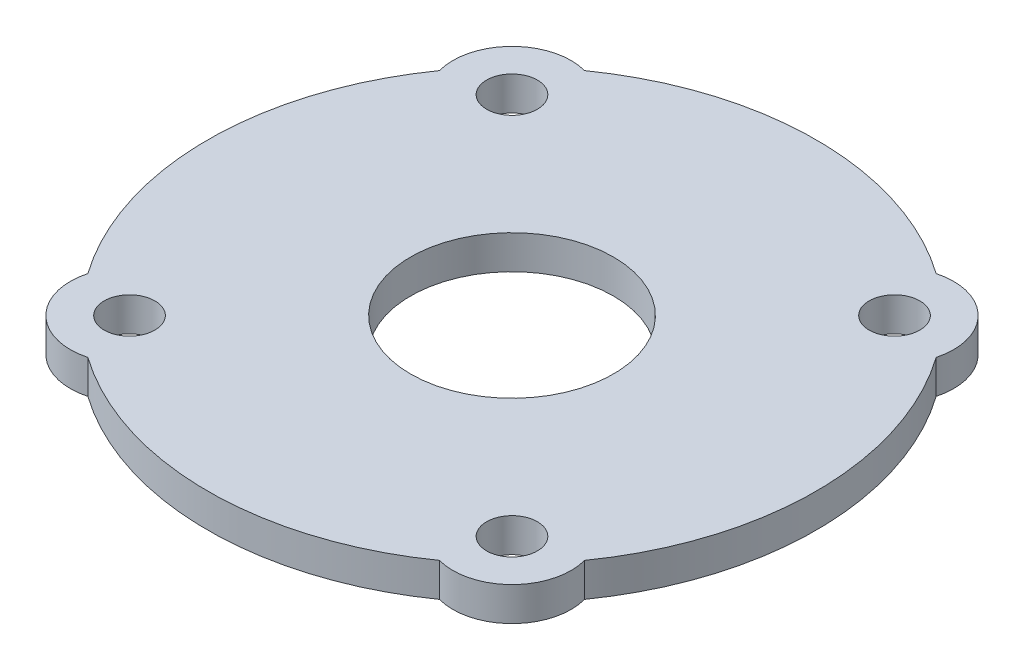
ISO-10303-21;
HEADER;
FILE_DESCRIPTION(('STEP AP214'),'2;1');
FILE_NAME('part.step','',(''),(''),'','','');
FILE_SCHEMA(('AUTOMOTIVE_DESIGN { 1 0 10303 214 1 1 1 1 }'));
ENDSEC;
DATA;
#1=APPLICATION_CONTEXT('core data for automotive mechanical design processes');
#2=APPLICATION_PROTOCOL_DEFINITION('international standard','automotive_design',2000,#1);
#3=PRODUCT_CONTEXT('',#1,'mechanical');
#4=PRODUCT('Part','Part','',(#3));
#5=PRODUCT_RELATED_PRODUCT_CATEGORY('part','',(#4));
#6=PRODUCT_DEFINITION_FORMATION('','',#4);
#7=PRODUCT_DEFINITION_CONTEXT('part definition',#1,'design');
#8=PRODUCT_DEFINITION('design','',#6,#7);
#9=PRODUCT_DEFINITION_SHAPE('','',#8);
#10=(LENGTH_UNIT() NAMED_UNIT(*) SI_UNIT(.MILLI.,.METRE.));
#11=(NAMED_UNIT(*) PLANE_ANGLE_UNIT() SI_UNIT($,.RADIAN.));
#12=(NAMED_UNIT(*) SI_UNIT($,.STERADIAN.) SOLID_ANGLE_UNIT());
#13=UNCERTAINTY_MEASURE_WITH_UNIT(LENGTH_MEASURE(1.E-05),#10,'distance_accuracy_value','');
#14=(GEOMETRIC_REPRESENTATION_CONTEXT(3) GLOBAL_UNCERTAINTY_ASSIGNED_CONTEXT((#13)) GLOBAL_UNIT_ASSIGNED_CONTEXT((#10,
#11,#12)) REPRESENTATION_CONTEXT('',''));
#15=CARTESIAN_POINT('',(0.,0.,0.));
#16=DIRECTION('',(0.,0.,1.));
#17=DIRECTION('',(1.,0.,0.));
#18=AXIS2_PLACEMENT_3D('',#15,#16,#17);
#19=CARTESIAN_POINT('',(-8.98025612106914,1.5875,-8.98025612106917));
#20=DIRECTION('',(0.,1.,0.));
#21=DIRECTION('',(0.,0.,1.));
#22=AXIS2_PLACEMENT_3D('',#19,#20,#21);
#23=PLANE('',#22);
#24=CARTESIAN_POINT('',(17.9605122421383,1.5875,17.9605122421383));
#25=DIRECTION('',(0.,1.,0.));
#26=DIRECTION('',(0.,0.,1.));
#27=AXIS2_PLACEMENT_3D('',#24,#25,#26);
#28=CIRCLE('',#27,2.38125);
#29=CARTESIAN_POINT('',(17.9605122421383,1.5875,20.3417622421383));
#30=VERTEX_POINT('',#29);
#31=EDGE_CURVE('E202',#30,#30,#28,.T.);
#32=ORIENTED_EDGE('',*,*,#31,.F.);
#33=EDGE_LOOP('',(#32));
#34=FACE_BOUND('',#33,.T.);
#35=CARTESIAN_POINT('',(17.9605122421383,1.5875,-17.9605122421383));
#36=DIRECTION('',(0.,1.,0.));
#37=DIRECTION('',(0.,0.,-1.));
#38=AXIS2_PLACEMENT_3D('',#35,#36,#37);
#39=CIRCLE('',#38,2.38125);
#40=CARTESIAN_POINT('',(17.9605122421383,1.5875,-20.3417622421383));
#41=VERTEX_POINT('',#40);
#42=EDGE_CURVE('E190',#41,#41,#39,.T.);
#43=ORIENTED_EDGE('',*,*,#42,.F.);
#44=EDGE_LOOP('',(#43));
#45=FACE_BOUND('',#44,.T.);
#46=CARTESIAN_POINT('',(0.,1.5875,0.));
#47=DIRECTION('',(0.,1.,0.));
#48=DIRECTION('',(0.,0.,1.));
#49=AXIS2_PLACEMENT_3D('',#46,#47,#48);
#50=CIRCLE('',#49,28.575);
#51=CARTESIAN_POINT('',(16.5086309525813,1.5875,-23.3237160219265));
#52=VERTEX_POINT('',#51);
#53=CARTESIAN_POINT('',(-16.5086309525813,1.5875,-23.3237160219265));
#54=VERTEX_POINT('',#53);
#55=EDGE_CURVE('E153',#52,#54,#50,.T.);
#56=ORIENTED_EDGE('',*,*,#55,.T.);
#57=CARTESIAN_POINT('',(-17.9605122421383,1.5875,-17.9605122421383));
#58=DIRECTION('',(0.,1.,0.));
#59=DIRECTION('',(0.,0.,1.));
#60=AXIS2_PLACEMENT_3D('',#57,#58,#59);
#61=CIRCLE('',#60,5.55625);
#62=CARTESIAN_POINT('',(-23.3237160219265,1.5875,-16.5086309525814));
#63=VERTEX_POINT('',#62);
#64=EDGE_CURVE('E101',#54,#63,#61,.T.);
#65=ORIENTED_EDGE('',*,*,#64,.T.);
#66=CARTESIAN_POINT('',(0.,1.5875,0.));
#67=DIRECTION('',(0.,1.,0.));
#68=DIRECTION('',(0.,0.,1.));
#69=AXIS2_PLACEMENT_3D('',#66,#67,#68);
#70=CIRCLE('',#69,28.575);
#71=CARTESIAN_POINT('',(-23.3237160219265,1.5875,16.5086309525814));
#72=VERTEX_POINT('',#71);
#73=EDGE_CURVE('E168',#63,#72,#70,.T.);
#74=ORIENTED_EDGE('',*,*,#73,.T.);
#75=CARTESIAN_POINT('',(-17.9605122421383,1.5875,17.9605122421383));
#76=DIRECTION('',(0.,1.,0.));
#77=DIRECTION('',(0.,0.,-1.));
#78=AXIS2_PLACEMENT_3D('',#75,#76,#77);
#79=CIRCLE('',#78,5.55625);
#80=CARTESIAN_POINT('',(-16.5086309525813,1.5875,23.3237160219265));
#81=VERTEX_POINT('',#80);
#82=EDGE_CURVE('E181',#72,#81,#79,.T.);
#83=ORIENTED_EDGE('',*,*,#82,.T.);
#84=CARTESIAN_POINT('',(0.,1.5875,0.));
#85=DIRECTION('',(0.,1.,0.));
#86=DIRECTION('',(0.,0.,1.));
#87=AXIS2_PLACEMENT_3D('',#84,#85,#86);
#88=CIRCLE('',#87,28.575);
#89=CARTESIAN_POINT('',(16.5086309525813,1.5875,23.3237160219265));
#90=VERTEX_POINT('',#89);
#91=EDGE_CURVE('E120',#81,#90,#88,.T.);
#92=ORIENTED_EDGE('',*,*,#91,.T.);
#93=CARTESIAN_POINT('',(17.9605122421383,1.5875,17.9605122421383));
#94=DIRECTION('',(0.,1.,0.));
#95=DIRECTION('',(0.,0.,1.));
#96=AXIS2_PLACEMENT_3D('',#93,#94,#95);
#97=CIRCLE('',#96,5.55625);
#98=CARTESIAN_POINT('',(23.3237160219265,1.5875,16.5086309525814));
#99=VERTEX_POINT('',#98);
#100=EDGE_CURVE('E114',#90,#99,#97,.T.);
#101=ORIENTED_EDGE('',*,*,#100,.T.);
#102=CARTESIAN_POINT('',(0.,1.5875,0.));
#103=DIRECTION('',(0.,1.,0.));
#104=DIRECTION('',(0.,0.,1.));
#105=AXIS2_PLACEMENT_3D('',#102,#103,#104);
#106=CIRCLE('',#105,28.575);
#107=CARTESIAN_POINT('',(23.3237160219265,1.5875,-16.5086309525814));
#108=VERTEX_POINT('',#107);
#109=EDGE_CURVE('E118',#99,#108,#106,.T.);
#110=ORIENTED_EDGE('',*,*,#109,.T.);
#111=CARTESIAN_POINT('',(17.9605122421383,1.5875,-17.9605122421383));
#112=DIRECTION('',(0.,1.,0.));
#113=DIRECTION('',(0.,0.,-1.));
#114=AXIS2_PLACEMENT_3D('',#111,#112,#113);
#115=CIRCLE('',#114,5.55625);
#116=EDGE_CURVE('E58',#108,#52,#115,.T.);
#117=ORIENTED_EDGE('',*,*,#116,.T.);
#118=EDGE_LOOP('',(#56,#65,#74,#83,#92,#101,#110,#117));
#119=FACE_BOUND('',#118,.T.);
#120=CARTESIAN_POINT('',(-17.9605122421383,1.5875,-17.9605122421383));
#121=DIRECTION('',(0.,1.,0.));
#122=DIRECTION('',(0.,0.,1.));
#123=AXIS2_PLACEMENT_3D('',#120,#121,#122);
#124=CIRCLE('',#123,2.38125);
#125=CARTESIAN_POINT('',(-17.9605122421383,1.5875,-15.5792622421383));
#126=VERTEX_POINT('',#125);
#127=EDGE_CURVE('E142',#126,#126,#124,.T.);
#128=ORIENTED_EDGE('',*,*,#127,.F.);
#129=EDGE_LOOP('',(#128));
#130=FACE_BOUND('',#129,.T.);
#131=CARTESIAN_POINT('',(-17.9605122421383,1.5875,17.9605122421383));
#132=DIRECTION('',(0.,1.,0.));
#133=DIRECTION('',(0.,0.,-1.));
#134=AXIS2_PLACEMENT_3D('',#131,#132,#133);
#135=CIRCLE('',#134,2.38125);
#136=CARTESIAN_POINT('',(-17.9605122421383,1.5875,15.5792622421383));
#137=VERTEX_POINT('',#136);
#138=EDGE_CURVE('E196',#137,#137,#135,.T.);
#139=ORIENTED_EDGE('',*,*,#138,.F.);
#140=EDGE_LOOP('',(#139));
#141=FACE_BOUND('',#140,.T.);
#142=CARTESIAN_POINT('',(0.,1.5875,0.));
#143=DIRECTION('',(0.,1.,0.));
#144=DIRECTION('',(0.,0.,1.));
#145=AXIS2_PLACEMENT_3D('',#142,#143,#144);
#146=CIRCLE('',#145,9.525);
#147=CARTESIAN_POINT('',(0.,1.5875,9.525));
#148=VERTEX_POINT('',#147);
#149=EDGE_CURVE('E208',#148,#148,#146,.T.);
#150=ORIENTED_EDGE('',*,*,#149,.F.);
#151=EDGE_LOOP('',(#150));
#152=FACE_BOUND('',#151,.T.);
#153=ADVANCED_FACE('F41',(#34,#45,#119,#130,#141,#152),#23,.T.);
#154=CARTESIAN_POINT('',(-8.98025612106914,-1.5875,-8.98025612106917));
#155=DIRECTION('',(0.,1.,0.));
#156=DIRECTION('',(0.,0.,1.));
#157=AXIS2_PLACEMENT_3D('',#154,#155,#156);
#158=PLANE('',#157);
#159=CARTESIAN_POINT('',(0.,-1.5875,0.));
#160=DIRECTION('',(0.,1.,0.));
#161=DIRECTION('',(0.,0.,1.));
#162=AXIS2_PLACEMENT_3D('',#159,#160,#161);
#163=CIRCLE('',#162,28.575);
#164=CARTESIAN_POINT('',(16.5086309525813,-1.5875,-23.3237160219265));
#165=VERTEX_POINT('',#164);
#166=CARTESIAN_POINT('',(-16.5086309525813,-1.5875,-23.3237160219265));
#167=VERTEX_POINT('',#166);
#168=EDGE_CURVE('E138',#165,#167,#163,.T.);
#169=ORIENTED_EDGE('',*,*,#168,.F.);
#170=CARTESIAN_POINT('',(17.9605122421383,-1.5875,-17.9605122421383));
#171=DIRECTION('',(0.,1.,0.));
#172=DIRECTION('',(0.,0.,-1.));
#173=AXIS2_PLACEMENT_3D('',#170,#171,#172);
#174=CIRCLE('',#173,5.55625);
#175=CARTESIAN_POINT('',(23.3237160219265,-1.5875,-16.5086309525814));
#176=VERTEX_POINT('',#175);
#177=EDGE_CURVE('E93',#176,#165,#174,.T.);
#178=ORIENTED_EDGE('',*,*,#177,.F.);
#179=CARTESIAN_POINT('',(0.,-1.5875,0.));
#180=DIRECTION('',(0.,1.,0.));
#181=DIRECTION('',(0.,0.,1.));
#182=AXIS2_PLACEMENT_3D('',#179,#180,#181);
#183=CIRCLE('',#182,28.575);
#184=CARTESIAN_POINT('',(23.3237160219265,-1.5875,16.5086309525814));
#185=VERTEX_POINT('',#184);
#186=EDGE_CURVE('E87',#185,#176,#183,.T.);
#187=ORIENTED_EDGE('',*,*,#186,.F.);
#188=CARTESIAN_POINT('',(17.9605122421383,-1.5875,17.9605122421383));
#189=DIRECTION('',(0.,1.,0.));
#190=DIRECTION('',(0.,0.,1.));
#191=AXIS2_PLACEMENT_3D('',#188,#189,#190);
#192=CIRCLE('',#191,5.55625);
#193=CARTESIAN_POINT('',(16.5086309525813,-1.5875,23.3237160219265));
#194=VERTEX_POINT('',#193);
#195=EDGE_CURVE('E128',#194,#185,#192,.T.);
#196=ORIENTED_EDGE('',*,*,#195,.F.);
#197=CARTESIAN_POINT('',(0.,-1.5875,0.));
#198=DIRECTION('',(0.,1.,0.));
#199=DIRECTION('',(0.,0.,1.));
#200=AXIS2_PLACEMENT_3D('',#197,#198,#199);
#201=CIRCLE('',#200,28.575);
#202=CARTESIAN_POINT('',(-16.5086309525813,-1.5875,23.3237160219265));
#203=VERTEX_POINT('',#202);
#204=EDGE_CURVE('E148',#203,#194,#201,.T.);
#205=ORIENTED_EDGE('',*,*,#204,.F.);
#206=CARTESIAN_POINT('',(-17.9605122421383,-1.5875,17.9605122421383));
#207=DIRECTION('',(0.,1.,0.));
#208=DIRECTION('',(0.,0.,-1.));
#209=AXIS2_PLACEMENT_3D('',#206,#207,#208);
#210=CIRCLE('',#209,5.55625);
#211=CARTESIAN_POINT('',(-23.3237160219265,-1.5875,16.5086309525814));
#212=VERTEX_POINT('',#211);
#213=EDGE_CURVE('E146',#212,#203,#210,.T.);
#214=ORIENTED_EDGE('',*,*,#213,.F.);
#215=CARTESIAN_POINT('',(0.,-1.5875,0.));
#216=DIRECTION('',(0.,1.,0.));
#217=DIRECTION('',(0.,0.,1.));
#218=AXIS2_PLACEMENT_3D('',#215,#216,#217);
#219=CIRCLE('',#218,28.575);
#220=CARTESIAN_POINT('',(-23.3237160219265,-1.5875,-16.5086309525814));
#221=VERTEX_POINT('',#220);
#222=EDGE_CURVE('E144',#221,#212,#219,.T.);
#223=ORIENTED_EDGE('',*,*,#222,.F.);
#224=CARTESIAN_POINT('',(-17.9605122421383,-1.5875,-17.9605122421383));
#225=DIRECTION('',(0.,1.,0.));
#226=DIRECTION('',(0.,0.,1.));
#227=AXIS2_PLACEMENT_3D('',#224,#225,#226);
#228=CIRCLE('',#227,5.55625);
#229=EDGE_CURVE('E141',#167,#221,#228,.T.);
#230=ORIENTED_EDGE('',*,*,#229,.F.);
#231=EDGE_LOOP('',(#169,#178,#187,#196,#205,#214,#223,#230));
#232=FACE_BOUND('',#231,.T.);
#233=CARTESIAN_POINT('',(-17.9605122421383,-1.5875,-17.9605122421383));
#234=DIRECTION('',(0.,1.,0.));
#235=DIRECTION('',(0.,0.,1.));
#236=AXIS2_PLACEMENT_3D('',#233,#234,#235);
#237=CIRCLE('',#236,2.38125);
#238=CARTESIAN_POINT('',(-17.9605122421383,-1.5875,-15.5792622421383));
#239=VERTEX_POINT('',#238);
#240=EDGE_CURVE('E187',#239,#239,#237,.T.);
#241=ORIENTED_EDGE('',*,*,#240,.T.);
#242=EDGE_LOOP('',(#241));
#243=FACE_BOUND('',#242,.T.);
#244=CARTESIAN_POINT('',(17.9605122421383,-1.5875,-17.9605122421383));
#245=DIRECTION('',(0.,1.,0.));
#246=DIRECTION('',(0.,0.,-1.));
#247=AXIS2_PLACEMENT_3D('',#244,#245,#246);
#248=CIRCLE('',#247,2.38125);
#249=CARTESIAN_POINT('',(17.9605122421383,-1.5875,-20.3417622421383));
#250=VERTEX_POINT('',#249);
#251=EDGE_CURVE('E193',#250,#250,#248,.T.);
#252=ORIENTED_EDGE('',*,*,#251,.T.);
#253=EDGE_LOOP('',(#252));
#254=FACE_BOUND('',#253,.T.);
#255=CARTESIAN_POINT('',(-17.9605122421383,-1.5875,17.9605122421383));
#256=DIRECTION('',(0.,1.,0.));
#257=DIRECTION('',(0.,0.,-1.));
#258=AXIS2_PLACEMENT_3D('',#255,#256,#257);
#259=CIRCLE('',#258,2.38125);
#260=CARTESIAN_POINT('',(-17.9605122421383,-1.5875,15.5792622421383));
#261=VERTEX_POINT('',#260);
#262=EDGE_CURVE('E199',#261,#261,#259,.T.);
#263=ORIENTED_EDGE('',*,*,#262,.T.);
#264=EDGE_LOOP('',(#263));
#265=FACE_BOUND('',#264,.T.);
#266=CARTESIAN_POINT('',(17.9605122421383,-1.5875,17.9605122421383));
#267=DIRECTION('',(0.,1.,0.));
#268=DIRECTION('',(0.,0.,1.));
#269=AXIS2_PLACEMENT_3D('',#266,#267,#268);
#270=CIRCLE('',#269,2.38125);
#271=CARTESIAN_POINT('',(17.9605122421383,-1.5875,20.3417622421383));
#272=VERTEX_POINT('',#271);
#273=EDGE_CURVE('E205',#272,#272,#270,.T.);
#274=ORIENTED_EDGE('',*,*,#273,.T.);
#275=EDGE_LOOP('',(#274));
#276=FACE_BOUND('',#275,.T.);
#277=CARTESIAN_POINT('',(0.,-1.5875,0.));
#278=DIRECTION('',(0.,1.,0.));
#279=DIRECTION('',(0.,0.,1.));
#280=AXIS2_PLACEMENT_3D('',#277,#278,#279);
#281=CIRCLE('',#280,9.525);
#282=CARTESIAN_POINT('',(0.,-1.5875,9.525));
#283=VERTEX_POINT('',#282);
#284=EDGE_CURVE('E211',#283,#283,#281,.T.);
#285=ORIENTED_EDGE('',*,*,#284,.T.);
#286=EDGE_LOOP('',(#285));
#287=FACE_BOUND('',#286,.T.);
#288=ADVANCED_FACE('F172',(#232,#243,#254,#265,#276,#287),#158,.F.);
#289=CARTESIAN_POINT('',(0.,1.5875,0.));
#290=DIRECTION('',(0.,-1.,0.));
#291=DIRECTION('',(0.,0.,-1.));
#292=AXIS2_PLACEMENT_3D('',#289,#290,#291);
#293=CYLINDRICAL_SURFACE('',#292,28.575);
#294=ORIENTED_EDGE('',*,*,#168,.T.);
#295=DIRECTION('',(0.,-1.,0.));
#296=VECTOR('',#295,1.);
#297=CARTESIAN_POINT('',(-16.5086309525813,1.5875,-23.3237160219265));
#298=LINE('',#297,#296);
#299=EDGE_CURVE('E11',#54,#167,#298,.T.);
#300=ORIENTED_EDGE('',*,*,#299,.F.);
#301=ORIENTED_EDGE('',*,*,#55,.F.);
#302=DIRECTION('',(0.,-1.,0.));
#303=VECTOR('',#302,1.);
#304=CARTESIAN_POINT('',(16.5086309525813,1.5875,-23.3237160219265));
#305=LINE('',#304,#303);
#306=EDGE_CURVE('E134',#52,#165,#305,.T.);
#307=ORIENTED_EDGE('',*,*,#306,.T.);
#308=EDGE_LOOP('',(#294,#300,#301,#307));
#309=FACE_BOUND('',#308,.T.);
#310=ADVANCED_FACE('F43',(#309),#293,.T.);
#311=CARTESIAN_POINT('',(-17.9605122421383,1.5875,-17.9605122421383));
#312=DIRECTION('',(0.,-1.,0.));
#313=DIRECTION('',(0.,0.,-1.));
#314=AXIS2_PLACEMENT_3D('',#311,#312,#313);
#315=CYLINDRICAL_SURFACE('',#314,5.55625);
#316=ORIENTED_EDGE('',*,*,#229,.T.);
#317=DIRECTION('',(0.,-1.,0.));
#318=VECTOR('',#317,1.);
#319=CARTESIAN_POINT('',(-23.3237160219265,1.5875,-16.5086309525814));
#320=LINE('',#319,#318);
#321=EDGE_CURVE('E50',#63,#221,#320,.T.);
#322=ORIENTED_EDGE('',*,*,#321,.F.);
#323=ORIENTED_EDGE('',*,*,#64,.F.);
#324=ORIENTED_EDGE('',*,*,#299,.T.);
#325=EDGE_LOOP('',(#316,#322,#323,#324));
#326=FACE_BOUND('',#325,.T.);
#327=ADVANCED_FACE('F245',(#326),#315,.T.);
#328=CARTESIAN_POINT('',(0.,1.5875,0.));
#329=DIRECTION('',(0.,-1.,0.));
#330=DIRECTION('',(0.,0.,-1.));
#331=AXIS2_PLACEMENT_3D('',#328,#329,#330);
#332=CYLINDRICAL_SURFACE('',#331,28.575);
#333=ORIENTED_EDGE('',*,*,#222,.T.);
#334=DIRECTION('',(0.,-1.,0.));
#335=VECTOR('',#334,1.);
#336=CARTESIAN_POINT('',(-23.3237160219265,1.5875,16.5086309525814));
#337=LINE('',#336,#335);
#338=EDGE_CURVE('E160',#72,#212,#337,.T.);
#339=ORIENTED_EDGE('',*,*,#338,.F.);
#340=ORIENTED_EDGE('',*,*,#73,.F.);
#341=ORIENTED_EDGE('',*,*,#321,.T.);
#342=EDGE_LOOP('',(#333,#339,#340,#341));
#343=FACE_BOUND('',#342,.T.);
#344=ADVANCED_FACE('F166',(#343),#332,.T.);
#345=CARTESIAN_POINT('',(-17.9605122421383,1.5875,17.9605122421383));
#346=DIRECTION('',(0.,-1.,0.));
#347=DIRECTION('',(0.,0.,-1.));
#348=AXIS2_PLACEMENT_3D('',#345,#346,#347);
#349=CYLINDRICAL_SURFACE('',#348,5.55625);
#350=ORIENTED_EDGE('',*,*,#213,.T.);
#351=DIRECTION('',(0.,-1.,0.));
#352=VECTOR('',#351,1.);
#353=CARTESIAN_POINT('',(-16.5086309525813,1.5875,23.3237160219265));
#354=LINE('',#353,#352);
#355=EDGE_CURVE('E157',#81,#203,#354,.T.);
#356=ORIENTED_EDGE('',*,*,#355,.F.);
#357=ORIENTED_EDGE('',*,*,#82,.F.);
#358=ORIENTED_EDGE('',*,*,#338,.T.);
#359=EDGE_LOOP('',(#350,#356,#357,#358));
#360=FACE_BOUND('',#359,.T.);
#361=ADVANCED_FACE('F177',(#360),#349,.T.);
#362=CARTESIAN_POINT('',(0.,1.5875,0.));
#363=DIRECTION('',(0.,-1.,0.));
#364=DIRECTION('',(0.,0.,-1.));
#365=AXIS2_PLACEMENT_3D('',#362,#363,#364);
#366=CYLINDRICAL_SURFACE('',#365,28.575);
#367=ORIENTED_EDGE('',*,*,#204,.T.);
#368=DIRECTION('',(0.,-1.,0.));
#369=VECTOR('',#368,1.);
#370=CARTESIAN_POINT('',(16.5086309525813,1.5875,23.3237160219265));
#371=LINE('',#370,#369);
#372=EDGE_CURVE('E129',#90,#194,#371,.T.);
#373=ORIENTED_EDGE('',*,*,#372,.F.);
#374=ORIENTED_EDGE('',*,*,#91,.F.);
#375=ORIENTED_EDGE('',*,*,#355,.T.);
#376=EDGE_LOOP('',(#367,#373,#374,#375));
#377=FACE_BOUND('',#376,.T.);
#378=ADVANCED_FACE('F180',(#377),#366,.T.);
#379=CARTESIAN_POINT('',(17.9605122421383,1.5875,17.9605122421383));
#380=DIRECTION('',(0.,-1.,0.));
#381=DIRECTION('',(0.,0.,-1.));
#382=AXIS2_PLACEMENT_3D('',#379,#380,#381);
#383=CYLINDRICAL_SURFACE('',#382,5.55625);
#384=ORIENTED_EDGE('',*,*,#195,.T.);
#385=DIRECTION('',(0.,-1.,0.));
#386=VECTOR('',#385,1.);
#387=CARTESIAN_POINT('',(23.3237160219265,1.5875,16.5086309525814));
#388=LINE('',#387,#386);
#389=EDGE_CURVE('E125',#99,#185,#388,.T.);
#390=ORIENTED_EDGE('',*,*,#389,.F.);
#391=ORIENTED_EDGE('',*,*,#100,.F.);
#392=ORIENTED_EDGE('',*,*,#372,.T.);
#393=EDGE_LOOP('',(#384,#390,#391,#392));
#394=FACE_BOUND('',#393,.T.);
#395=ADVANCED_FACE('F126',(#394),#383,.T.);
#396=CARTESIAN_POINT('',(0.,1.5875,0.));
#397=DIRECTION('',(0.,-1.,0.));
#398=DIRECTION('',(0.,0.,-1.));
#399=AXIS2_PLACEMENT_3D('',#396,#397,#398);
#400=CYLINDRICAL_SURFACE('',#399,28.575);
#401=ORIENTED_EDGE('',*,*,#186,.T.);
#402=DIRECTION('',(0.,-1.,0.));
#403=VECTOR('',#402,1.);
#404=CARTESIAN_POINT('',(23.3237160219265,1.5875,-16.5086309525814));
#405=LINE('',#404,#403);
#406=EDGE_CURVE('E130',#108,#176,#405,.T.);
#407=ORIENTED_EDGE('',*,*,#406,.F.);
#408=ORIENTED_EDGE('',*,*,#109,.F.);
#409=ORIENTED_EDGE('',*,*,#389,.T.);
#410=EDGE_LOOP('',(#401,#407,#408,#409));
#411=FACE_BOUND('',#410,.T.);
#412=ADVANCED_FACE('F132',(#411),#400,.T.);
#413=CARTESIAN_POINT('',(17.9605122421383,1.5875,-17.9605122421383));
#414=DIRECTION('',(0.,-1.,0.));
#415=DIRECTION('',(0.,0.,-1.));
#416=AXIS2_PLACEMENT_3D('',#413,#414,#415);
#417=CYLINDRICAL_SURFACE('',#416,5.55625);
#418=ORIENTED_EDGE('',*,*,#177,.T.);
#419=ORIENTED_EDGE('',*,*,#306,.F.);
#420=ORIENTED_EDGE('',*,*,#116,.F.);
#421=ORIENTED_EDGE('',*,*,#406,.T.);
#422=EDGE_LOOP('',(#418,#419,#420,#421));
#423=FACE_BOUND('',#422,.T.);
#424=ADVANCED_FACE('F233',(#423),#417,.T.);
#425=CARTESIAN_POINT('',(-17.9605122421383,1.5875,-17.9605122421383));
#426=DIRECTION('',(0.,-1.,0.));
#427=DIRECTION('',(0.,0.,-1.));
#428=AXIS2_PLACEMENT_3D('',#425,#426,#427);
#429=CYLINDRICAL_SURFACE('',#428,2.38125);
#430=ORIENTED_EDGE('',*,*,#127,.T.);
#431=EDGE_LOOP('',(#430));
#432=FACE_BOUND('',#431,.T.);
#433=ORIENTED_EDGE('',*,*,#240,.F.);
#434=EDGE_LOOP('',(#433));
#435=FACE_BOUND('',#434,.T.);
#436=ADVANCED_FACE('F230',(#432,#435),#429,.F.);
#437=CARTESIAN_POINT('',(17.9605122421383,1.5875,-17.9605122421383));
#438=DIRECTION('',(0.,-1.,0.));
#439=DIRECTION('',(0.,0.,-1.));
#440=AXIS2_PLACEMENT_3D('',#437,#438,#439);
#441=CYLINDRICAL_SURFACE('',#440,2.38125);
#442=ORIENTED_EDGE('',*,*,#42,.T.);
#443=EDGE_LOOP('',(#442));
#444=FACE_BOUND('',#443,.T.);
#445=ORIENTED_EDGE('',*,*,#251,.F.);
#446=EDGE_LOOP('',(#445));
#447=FACE_BOUND('',#446,.T.);
#448=ADVANCED_FACE('F321',(#444,#447),#441,.F.);
#449=CARTESIAN_POINT('',(-17.9605122421383,1.5875,17.9605122421383));
#450=DIRECTION('',(0.,-1.,0.));
#451=DIRECTION('',(0.,0.,-1.));
#452=AXIS2_PLACEMENT_3D('',#449,#450,#451);
#453=CYLINDRICAL_SURFACE('',#452,2.38125);
#454=ORIENTED_EDGE('',*,*,#138,.T.);
#455=EDGE_LOOP('',(#454));
#456=FACE_BOUND('',#455,.T.);
#457=ORIENTED_EDGE('',*,*,#262,.F.);
#458=EDGE_LOOP('',(#457));
#459=FACE_BOUND('',#458,.T.);
#460=ADVANCED_FACE('F330',(#456,#459),#453,.F.);
#461=CARTESIAN_POINT('',(17.9605122421383,1.5875,17.9605122421383));
#462=DIRECTION('',(0.,-1.,0.));
#463=DIRECTION('',(0.,0.,-1.));
#464=AXIS2_PLACEMENT_3D('',#461,#462,#463);
#465=CYLINDRICAL_SURFACE('',#464,2.38125);
#466=ORIENTED_EDGE('',*,*,#31,.T.);
#467=EDGE_LOOP('',(#466));
#468=FACE_BOUND('',#467,.T.);
#469=ORIENTED_EDGE('',*,*,#273,.F.);
#470=EDGE_LOOP('',(#469));
#471=FACE_BOUND('',#470,.T.);
#472=ADVANCED_FACE('F339',(#468,#471),#465,.F.);
#473=CARTESIAN_POINT('',(0.,1.5875,0.));
#474=DIRECTION('',(0.,-1.,0.));
#475=DIRECTION('',(0.,0.,-1.));
#476=AXIS2_PLACEMENT_3D('',#473,#474,#475);
#477=CYLINDRICAL_SURFACE('',#476,9.525);
#478=ORIENTED_EDGE('',*,*,#149,.T.);
#479=EDGE_LOOP('',(#478));
#480=FACE_BOUND('',#479,.T.);
#481=ORIENTED_EDGE('',*,*,#284,.F.);
#482=EDGE_LOOP('',(#481));
#483=FACE_BOUND('',#482,.T.);
#484=ADVANCED_FACE('F217',(#480,#483),#477,.F.);
#485=CLOSED_SHELL('',(#153,#288,#310,#327,#344,#361,#378,#395,#412,#424,#436,#448,#460,#472,#484));
#486=MANIFOLD_SOLID_BREP('B2',#485);
#487=ADVANCED_BREP_SHAPE_REPRESENTATION('',(#18,#486),#14);
#488=SHAPE_DEFINITION_REPRESENTATION(#9,#487);
ENDSEC;
END-ISO-10303-21;
